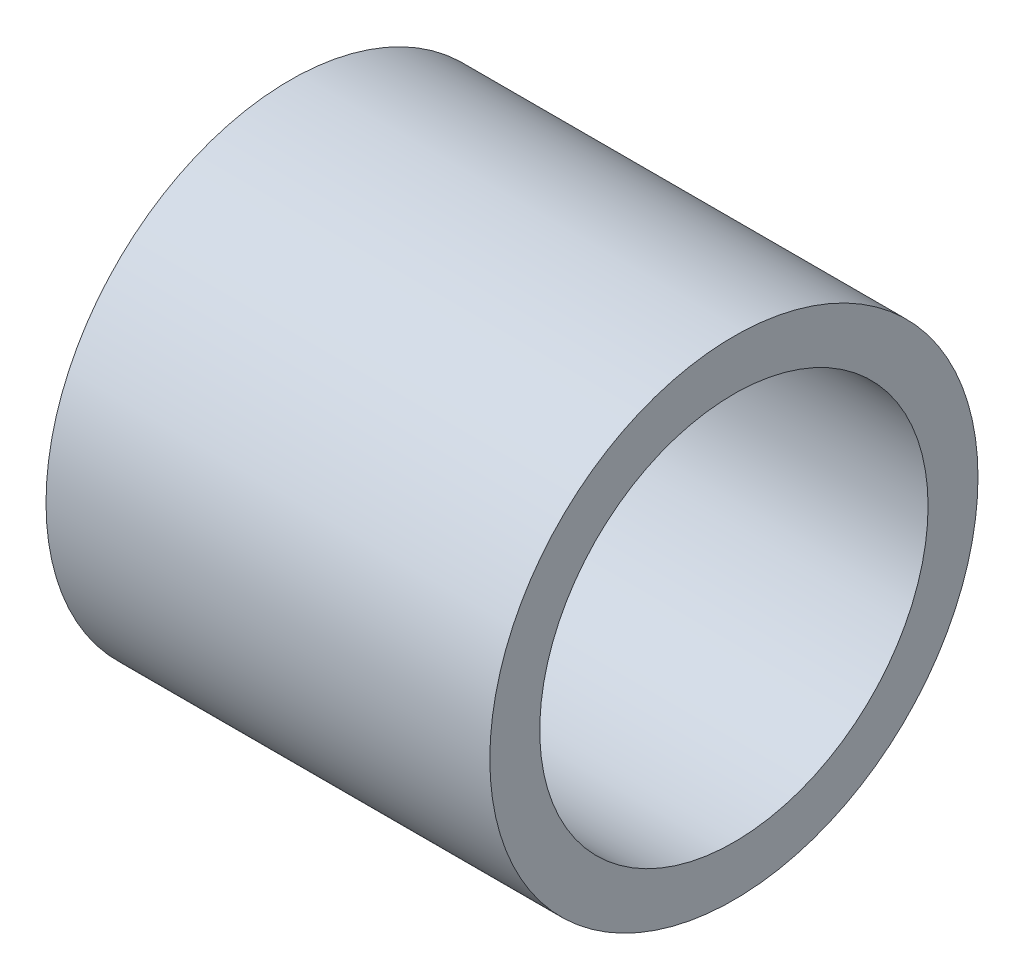
ISO-10303-21;
HEADER;
FILE_DESCRIPTION(('STEP AP214'),'2;1');
FILE_NAME('part.step','',(''),(''),'','','');
FILE_SCHEMA(('AUTOMOTIVE_DESIGN { 1 0 10303 214 1 1 1 1 }'));
ENDSEC;
DATA;
#1=APPLICATION_CONTEXT('core data for automotive mechanical design processes');
#2=APPLICATION_PROTOCOL_DEFINITION('international standard','automotive_design',2000,#1);
#3=PRODUCT_CONTEXT('',#1,'mechanical');
#4=PRODUCT('Part','Part','',(#3));
#5=PRODUCT_RELATED_PRODUCT_CATEGORY('part','',(#4));
#6=PRODUCT_DEFINITION_FORMATION('','',#4);
#7=PRODUCT_DEFINITION_CONTEXT('part definition',#1,'design');
#8=PRODUCT_DEFINITION('design','',#6,#7);
#9=PRODUCT_DEFINITION_SHAPE('','',#8);
#10=(LENGTH_UNIT() NAMED_UNIT(*) SI_UNIT(.MILLI.,.METRE.));
#11=(NAMED_UNIT(*) PLANE_ANGLE_UNIT() SI_UNIT($,.RADIAN.));
#12=(NAMED_UNIT(*) SI_UNIT($,.STERADIAN.) SOLID_ANGLE_UNIT());
#13=UNCERTAINTY_MEASURE_WITH_UNIT(LENGTH_MEASURE(1.E-05),#10,'distance_accuracy_value','');
#14=(GEOMETRIC_REPRESENTATION_CONTEXT(3) GLOBAL_UNCERTAINTY_ASSIGNED_CONTEXT((#13)) GLOBAL_UNIT_ASSIGNED_CONTEXT((#10,
#11,#12)) REPRESENTATION_CONTEXT('',''));
#15=CARTESIAN_POINT('',(0.,0.,0.));
#16=DIRECTION('',(0.,0.,1.));
#17=DIRECTION('',(1.,0.,0.));
#18=AXIS2_PLACEMENT_3D('',#15,#16,#17);
#19=CARTESIAN_POINT('',(20.,0.,0.));
#20=DIRECTION('',(1.,0.,0.));
#21=DIRECTION('',(0.,0.,-1.));
#22=AXIS2_PLACEMENT_3D('',#19,#20,#21);
#23=PLANE('',#22);
#24=CARTESIAN_POINT('',(20.,0.,0.));
#25=DIRECTION('',(1.,0.,0.));
#26=DIRECTION('',(0.,0.,-1.));
#27=AXIS2_PLACEMENT_3D('',#24,#25,#26);
#28=CIRCLE('',#27,11.);
#29=CARTESIAN_POINT('',(20.,0.,-11.));
#30=VERTEX_POINT('',#29);
#31=EDGE_CURVE('E10',#30,#30,#28,.T.);
#32=ORIENTED_EDGE('',*,*,#31,.T.);
#33=EDGE_LOOP('',(#32));
#34=FACE_BOUND('',#33,.T.);
#35=CARTESIAN_POINT('',(20.,0.,0.));
#36=DIRECTION('',(1.,0.,0.));
#37=DIRECTION('',(0.,0.,-1.));
#38=AXIS2_PLACEMENT_3D('',#35,#36,#37);
#39=CIRCLE('',#38,8.75);
#40=CARTESIAN_POINT('',(20.,0.,-8.75));
#41=VERTEX_POINT('',#40);
#42=EDGE_CURVE('E52',#41,#41,#39,.T.);
#43=ORIENTED_EDGE('',*,*,#42,.F.);
#44=EDGE_LOOP('',(#43));
#45=FACE_BOUND('',#44,.T.);
#46=ADVANCED_FACE('F41',(#34,#45),#23,.T.);
#47=CARTESIAN_POINT('',(0.,0.,0.));
#48=DIRECTION('',(1.,0.,0.));
#49=DIRECTION('',(0.,0.,-1.));
#50=AXIS2_PLACEMENT_3D('',#47,#48,#49);
#51=PLANE('',#50);
#52=CARTESIAN_POINT('',(0.,0.,0.));
#53=DIRECTION('',(1.,0.,0.));
#54=DIRECTION('',(0.,0.,-1.));
#55=AXIS2_PLACEMENT_3D('',#52,#53,#54);
#56=CIRCLE('',#55,11.);
#57=CARTESIAN_POINT('',(0.,0.,-11.));
#58=VERTEX_POINT('',#57);
#59=EDGE_CURVE('E45',#58,#58,#56,.T.);
#60=ORIENTED_EDGE('',*,*,#59,.F.);
#61=EDGE_LOOP('',(#60));
#62=FACE_BOUND('',#61,.T.);
#63=CARTESIAN_POINT('',(0.,0.,0.));
#64=DIRECTION('',(1.,0.,0.));
#65=DIRECTION('',(0.,0.,-1.));
#66=AXIS2_PLACEMENT_3D('',#63,#64,#65);
#67=CIRCLE('',#66,8.75);
#68=CARTESIAN_POINT('',(0.,0.,-8.75));
#69=VERTEX_POINT('',#68);
#70=EDGE_CURVE('E54',#69,#69,#67,.T.);
#71=ORIENTED_EDGE('',*,*,#70,.T.);
#72=EDGE_LOOP('',(#71));
#73=FACE_BOUND('',#72,.T.);
#74=ADVANCED_FACE('F64',(#62,#73),#51,.F.);
#75=CARTESIAN_POINT('',(20.,0.,0.));
#76=DIRECTION('',(-1.,0.,0.));
#77=DIRECTION('',(0.,0.,1.));
#78=AXIS2_PLACEMENT_3D('',#75,#76,#77);
#79=CYLINDRICAL_SURFACE('',#78,11.);
#80=ORIENTED_EDGE('',*,*,#31,.F.);
#81=EDGE_LOOP('',(#80));
#82=FACE_BOUND('',#81,.T.);
#83=ORIENTED_EDGE('',*,*,#59,.T.);
#84=EDGE_LOOP('',(#83));
#85=FACE_BOUND('',#84,.T.);
#86=ADVANCED_FACE('F43',(#82,#85),#79,.T.);
#87=CARTESIAN_POINT('',(20.,0.,0.));
#88=DIRECTION('',(-1.,0.,0.));
#89=DIRECTION('',(0.,0.,1.));
#90=AXIS2_PLACEMENT_3D('',#87,#88,#89);
#91=CYLINDRICAL_SURFACE('',#90,8.75);
#92=ORIENTED_EDGE('',*,*,#42,.T.);
#93=EDGE_LOOP('',(#92));
#94=FACE_BOUND('',#93,.T.);
#95=ORIENTED_EDGE('',*,*,#70,.F.);
#96=EDGE_LOOP('',(#95));
#97=FACE_BOUND('',#96,.T.);
#98=ADVANCED_FACE('F60',(#94,#97),#91,.F.);
#99=CLOSED_SHELL('',(#46,#74,#86,#98));
#100=MANIFOLD_SOLID_BREP('B2',#99);
#101=ADVANCED_BREP_SHAPE_REPRESENTATION('',(#18,#100),#14);
#102=SHAPE_DEFINITION_REPRESENTATION(#9,#101);
ENDSEC;
END-ISO-10303-21;
